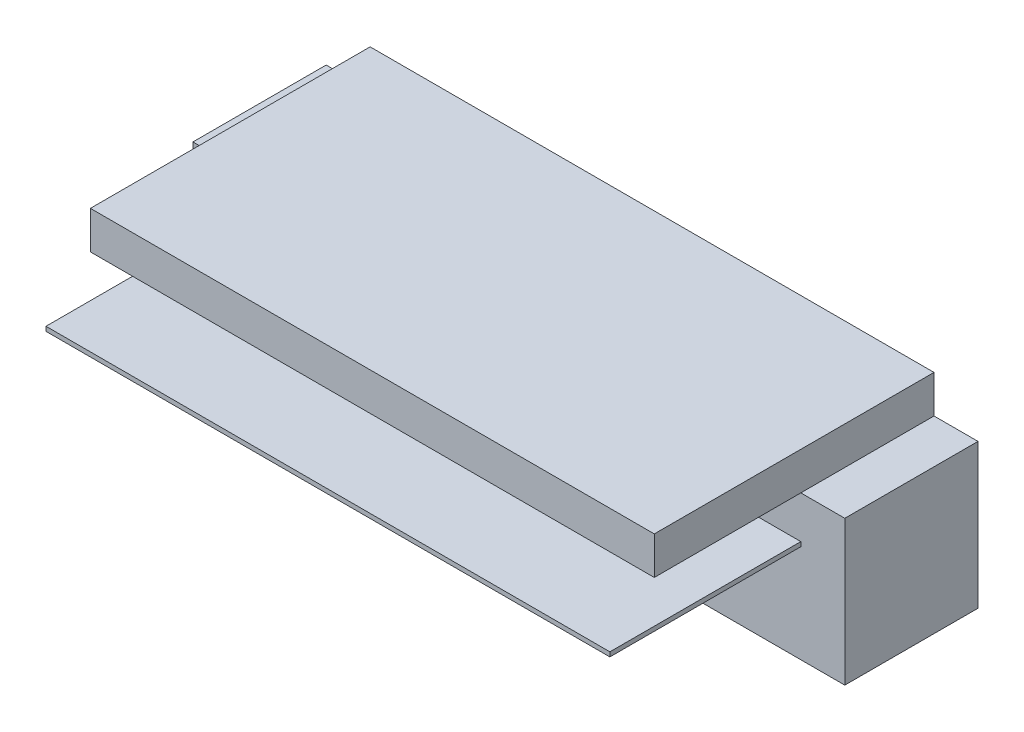
ISO-10303-21;
HEADER;
FILE_DESCRIPTION(('STEP AP214'),'2;1');
FILE_NAME('part.step','',(''),(''),'','','');
FILE_SCHEMA(('AUTOMOTIVE_DESIGN { 1 0 10303 214 1 1 1 1 }'));
ENDSEC;
DATA;
#1=APPLICATION_CONTEXT('core data for automotive mechanical design processes');
#2=APPLICATION_PROTOCOL_DEFINITION('international standard','automotive_design',2000,#1);
#3=PRODUCT_CONTEXT('',#1,'mechanical');
#4=PRODUCT('Part','Part','',(#3));
#5=PRODUCT_RELATED_PRODUCT_CATEGORY('part','',(#4));
#6=PRODUCT_DEFINITION_FORMATION('','',#4);
#7=PRODUCT_DEFINITION_CONTEXT('part definition',#1,'design');
#8=PRODUCT_DEFINITION('design','',#6,#7);
#9=PRODUCT_DEFINITION_SHAPE('','',#8);
#10=(LENGTH_UNIT() NAMED_UNIT(*) SI_UNIT(.MILLI.,.METRE.));
#11=(NAMED_UNIT(*) PLANE_ANGLE_UNIT() SI_UNIT($,.RADIAN.));
#12=(NAMED_UNIT(*) SI_UNIT($,.STERADIAN.) SOLID_ANGLE_UNIT());
#13=UNCERTAINTY_MEASURE_WITH_UNIT(LENGTH_MEASURE(1.E-05),#10,'distance_accuracy_value','');
#14=(GEOMETRIC_REPRESENTATION_CONTEXT(3) GLOBAL_UNCERTAINTY_ASSIGNED_CONTEXT((#13)) GLOBAL_UNIT_ASSIGNED_CONTEXT((#10,
#11,#12)) REPRESENTATION_CONTEXT('',''));
#15=CARTESIAN_POINT('',(0.,0.,0.));
#16=DIRECTION('',(0.,0.,1.));
#17=DIRECTION('',(1.,0.,0.));
#18=AXIS2_PLACEMENT_3D('',#15,#16,#17);
#19=CARTESIAN_POINT('',(14.6812,8.21,-0.300000000000005));
#20=DIRECTION('',(0.,0.,1.));
#21=DIRECTION('',(1.,0.,0.));
#22=AXIS2_PLACEMENT_3D('',#19,#20,#21);
#23=PLANE('',#22);
#24=DIRECTION('',(0.,1.,0.));
#25=VECTOR('',#24,1.);
#26=CARTESIAN_POINT('',(-14.6812,0.,-0.300000000000002));
#27=LINE('',#26,#25);
#28=CARTESIAN_POINT('',(-14.6812,0.,-0.300000000000003));
#29=VERTEX_POINT('',#28);
#30=CARTESIAN_POINT('',(-14.6812,6.51,-0.300000000000009));
#31=VERTEX_POINT('',#30);
#32=EDGE_CURVE('E159',#29,#31,#27,.T.);
#33=ORIENTED_EDGE('',*,*,#32,.F.);
#34=DIRECTION('',(-1.,0.,0.));
#35=VECTOR('',#34,1.);
#36=CARTESIAN_POINT('',(-14.6812,0.,-0.300000000000002));
#37=LINE('',#36,#35);
#38=CARTESIAN_POINT('',(14.6812,0.,-0.300000000000002));
#39=VERTEX_POINT('',#38);
#40=EDGE_CURVE('E161',#39,#29,#37,.T.);
#41=ORIENTED_EDGE('',*,*,#40,.F.);
#42=DIRECTION('',(0.,-1.,0.));
#43=VECTOR('',#42,1.);
#44=CARTESIAN_POINT('',(14.6812,0.,-0.300000000000009));
#45=LINE('',#44,#43);
#46=CARTESIAN_POINT('',(14.6812,6.51,-0.300000000000009));
#47=VERTEX_POINT('',#46);
#48=EDGE_CURVE('E148',#47,#39,#45,.T.);
#49=ORIENTED_EDGE('',*,*,#48,.F.);
#50=DIRECTION('',(1.,0.,0.));
#51=VECTOR('',#50,1.);
#52=CARTESIAN_POINT('',(-14.6812,6.51,-0.300000000000002));
#53=LINE('',#52,#51);
#54=CARTESIAN_POINT('',(12.7,6.51,-0.30000000000001));
#55=VERTEX_POINT('',#54);
#56=EDGE_CURVE('E152',#55,#47,#53,.T.);
#57=ORIENTED_EDGE('',*,*,#56,.F.);
#58=CARTESIAN_POINT('',(-12.7,6.51,-0.300000000000002));
#59=VERTEX_POINT('',#58);
#60=EDGE_CURVE('E214',#59,#55,#53,.T.);
#61=ORIENTED_EDGE('',*,*,#60,.F.);
#62=EDGE_CURVE('E213',#31,#59,#53,.T.);
#63=ORIENTED_EDGE('',*,*,#62,.F.);
#64=EDGE_LOOP('',(#33,#41,#49,#57,#61,#63));
#65=FACE_BOUND('',#64,.T.);
#66=DIRECTION('',(1.,0.,0.));
#67=VECTOR('',#66,1.);
#68=CARTESIAN_POINT('',(14.6812,4.61,-0.300000000000005));
#69=LINE('',#68,#67);
#70=CARTESIAN_POINT('',(-12.7,4.61,-0.300000000000002));
#71=VERTEX_POINT('',#70);
#72=CARTESIAN_POINT('',(12.7,4.61,-0.300000000000005));
#73=VERTEX_POINT('',#72);
#74=EDGE_CURVE('E181',#71,#73,#69,.T.);
#75=ORIENTED_EDGE('',*,*,#74,.T.);
#76=DIRECTION('',(0.,-1.,0.));
#77=VECTOR('',#76,1.);
#78=CARTESIAN_POINT('',(12.7,8.21,-0.300000000000005));
#79=LINE('',#78,#77);
#80=CARTESIAN_POINT('',(12.7,4.41,-0.300000000000002));
#81=VERTEX_POINT('',#80);
#82=EDGE_CURVE('E43',#73,#81,#79,.T.);
#83=ORIENTED_EDGE('',*,*,#82,.T.);
#84=DIRECTION('',(-1.,0.,0.));
#85=VECTOR('',#84,1.);
#86=CARTESIAN_POINT('',(14.6812,4.41,-0.300000000000005));
#87=LINE('',#86,#85);
#88=CARTESIAN_POINT('',(-12.7,4.41,-0.300000000000002));
#89=VERTEX_POINT('',#88);
#90=EDGE_CURVE('E187',#81,#89,#87,.T.);
#91=ORIENTED_EDGE('',*,*,#90,.T.);
#92=DIRECTION('',(0.,1.,0.));
#93=VECTOR('',#92,1.);
#94=CARTESIAN_POINT('',(-12.7,8.21,-0.3));
#95=LINE('',#94,#93);
#96=EDGE_CURVE('E184',#89,#71,#95,.T.);
#97=ORIENTED_EDGE('',*,*,#96,.T.);
#98=EDGE_LOOP('',(#75,#83,#91,#97));
#99=FACE_BOUND('',#98,.T.);
#100=ADVANCED_FACE('F35',(#65,#99),#23,.T.);
#101=CARTESIAN_POINT('',(0.,0.,0.));
#102=DIRECTION('',(0.,1.,0.));
#103=DIRECTION('',(0.,0.,1.));
#104=AXIS2_PLACEMENT_3D('',#101,#102,#103);
#105=PLANE('',#104);
#106=ORIENTED_EDGE('',*,*,#40,.T.);
#107=DIRECTION('',(0.,0.,1.));
#108=VECTOR('',#107,1.);
#109=CARTESIAN_POINT('',(-14.6812,0.,6.3));
#110=LINE('',#109,#108);
#111=CARTESIAN_POINT('',(-14.6812,0.,-6.3));
#112=VERTEX_POINT('',#111);
#113=EDGE_CURVE('E164',#112,#29,#110,.T.);
#114=ORIENTED_EDGE('',*,*,#113,.F.);
#115=DIRECTION('',(-1.,0.,0.));
#116=VECTOR('',#115,1.);
#117=CARTESIAN_POINT('',(14.6812,0.,-6.30000000000001));
#118=LINE('',#117,#116);
#119=CARTESIAN_POINT('',(14.6812,0.,-6.30000000000001));
#120=VERTEX_POINT('',#119);
#121=EDGE_CURVE('E167',#120,#112,#118,.T.);
#122=ORIENTED_EDGE('',*,*,#121,.F.);
#123=DIRECTION('',(0.,0.,-1.));
#124=VECTOR('',#123,1.);
#125=CARTESIAN_POINT('',(14.6812,0.,6.3));
#126=LINE('',#125,#124);
#127=EDGE_CURVE('E173',#39,#120,#126,.T.);
#128=ORIENTED_EDGE('',*,*,#127,.F.);
#129=EDGE_LOOP('',(#106,#114,#122,#128));
#130=FACE_BOUND('',#129,.T.);
#131=ADVANCED_FACE('F238',(#130),#105,.F.);
#132=CARTESIAN_POINT('',(-14.6812,8.21,6.3));
#133=DIRECTION('',(1.,0.,0.));
#134=DIRECTION('',(0.,0.,-1.));
#135=AXIS2_PLACEMENT_3D('',#132,#133,#134);
#136=PLANE('',#135);
#137=ORIENTED_EDGE('',*,*,#32,.T.);
#138=DIRECTION('',(0.,0.,1.));
#139=VECTOR('',#138,1.);
#140=CARTESIAN_POINT('',(-14.6812,6.51,6.3));
#141=LINE('',#140,#139);
#142=CARTESIAN_POINT('',(-14.6812,6.51,-6.3));
#143=VERTEX_POINT('',#142);
#144=EDGE_CURVE('E243',#143,#31,#141,.T.);
#145=ORIENTED_EDGE('',*,*,#144,.F.);
#146=DIRECTION('',(0.,-1.,0.));
#147=VECTOR('',#146,1.);
#148=CARTESIAN_POINT('',(-14.6812,8.21,-6.3));
#149=LINE('',#148,#147);
#150=EDGE_CURVE('E170',#143,#112,#149,.T.);
#151=ORIENTED_EDGE('',*,*,#150,.T.);
#152=ORIENTED_EDGE('',*,*,#113,.T.);
#153=EDGE_LOOP('',(#137,#145,#151,#152));
#154=FACE_BOUND('',#153,.T.);
#155=ADVANCED_FACE('F37',(#154),#136,.F.);
#156=CARTESIAN_POINT('',(14.6812,8.21,6.3));
#157=DIRECTION('',(0.,0.,-1.));
#158=DIRECTION('',(-1.,0.,0.));
#159=AXIS2_PLACEMENT_3D('',#156,#157,#158);
#160=PLANE('',#159);
#161=DIRECTION('',(1.,0.,0.));
#162=VECTOR('',#161,1.);
#163=CARTESIAN_POINT('',(14.6812,8.21,6.3));
#164=LINE('',#163,#162);
#165=CARTESIAN_POINT('',(-12.7,8.21,6.3));
#166=VERTEX_POINT('',#165);
#167=CARTESIAN_POINT('',(12.7,8.21,6.3));
#168=VERTEX_POINT('',#167);
#169=EDGE_CURVE('E144',#166,#168,#164,.T.);
#170=ORIENTED_EDGE('',*,*,#169,.F.);
#171=DIRECTION('',(0.,1.,0.));
#172=VECTOR('',#171,1.);
#173=CARTESIAN_POINT('',(-12.7,6.51,6.3));
#174=LINE('',#173,#172);
#175=CARTESIAN_POINT('',(-12.7,6.51,6.3));
#176=VERTEX_POINT('',#175);
#177=EDGE_CURVE('E130',#176,#166,#174,.T.);
#178=ORIENTED_EDGE('',*,*,#177,.F.);
#179=DIRECTION('',(-1.,0.,0.));
#180=VECTOR('',#179,1.);
#181=CARTESIAN_POINT('',(-14.6812,6.51,6.3));
#182=LINE('',#181,#180);
#183=CARTESIAN_POINT('',(12.7,6.51,6.3));
#184=VERTEX_POINT('',#183);
#185=EDGE_CURVE('E142',#184,#176,#182,.T.);
#186=ORIENTED_EDGE('',*,*,#185,.F.);
#187=DIRECTION('',(0.,1.,0.));
#188=VECTOR('',#187,1.);
#189=CARTESIAN_POINT('',(12.7,6.51,6.3));
#190=LINE('',#189,#188);
#191=EDGE_CURVE('E50',#184,#168,#190,.T.);
#192=ORIENTED_EDGE('',*,*,#191,.T.);
#193=EDGE_LOOP('',(#170,#178,#186,#192));
#194=FACE_BOUND('',#193,.T.);
#195=ADVANCED_FACE('F141',(#194),#160,.F.);
#196=CARTESIAN_POINT('',(14.6812,8.21,6.3));
#197=DIRECTION('',(-1.,0.,0.));
#198=DIRECTION('',(0.,0.,1.));
#199=AXIS2_PLACEMENT_3D('',#196,#197,#198);
#200=PLANE('',#199);
#201=DIRECTION('',(0.,-1.,0.));
#202=VECTOR('',#201,1.);
#203=CARTESIAN_POINT('',(14.6812,8.21,-6.30000000000001));
#204=LINE('',#203,#202);
#205=CARTESIAN_POINT('',(14.6812,6.51,-6.30000000000001));
#206=VERTEX_POINT('',#205);
#207=EDGE_CURVE('E179',#206,#120,#204,.T.);
#208=ORIENTED_EDGE('',*,*,#207,.F.);
#209=DIRECTION('',(0.,0.,-1.));
#210=VECTOR('',#209,1.);
#211=CARTESIAN_POINT('',(14.6812,6.51,-6.30000000000001));
#212=LINE('',#211,#210);
#213=EDGE_CURVE('E224',#47,#206,#212,.T.);
#214=ORIENTED_EDGE('',*,*,#213,.F.);
#215=ORIENTED_EDGE('',*,*,#48,.T.);
#216=ORIENTED_EDGE('',*,*,#127,.T.);
#217=EDGE_LOOP('',(#208,#214,#215,#216));
#218=FACE_BOUND('',#217,.T.);
#219=ADVANCED_FACE('F231',(#218),#200,.F.);
#220=CARTESIAN_POINT('',(14.6812,8.21,-6.30000000000001));
#221=DIRECTION('',(0.,0.,1.));
#222=DIRECTION('',(1.,0.,0.));
#223=AXIS2_PLACEMENT_3D('',#220,#221,#222);
#224=PLANE('',#223);
#225=DIRECTION('',(-1.,0.,0.));
#226=VECTOR('',#225,1.);
#227=CARTESIAN_POINT('',(-14.6812,6.51,-6.3));
#228=LINE('',#227,#226);
#229=CARTESIAN_POINT('',(-12.7,6.51,-6.30000000000001));
#230=VERTEX_POINT('',#229);
#231=EDGE_CURVE('E136',#230,#143,#228,.T.);
#232=ORIENTED_EDGE('',*,*,#231,.F.);
#233=DIRECTION('',(0.,1.,0.));
#234=VECTOR('',#233,1.);
#235=CARTESIAN_POINT('',(-12.7,6.51,-6.30000000000001));
#236=LINE('',#235,#234);
#237=CARTESIAN_POINT('',(-12.7,8.21,-6.30000000000001));
#238=VERTEX_POINT('',#237);
#239=EDGE_CURVE('E145',#230,#238,#236,.T.);
#240=ORIENTED_EDGE('',*,*,#239,.T.);
#241=DIRECTION('',(-1.,0.,0.));
#242=VECTOR('',#241,1.);
#243=CARTESIAN_POINT('',(14.6812,8.21,-6.30000000000001));
#244=LINE('',#243,#242);
#245=CARTESIAN_POINT('',(12.7,8.21,-6.30000000000001));
#246=VERTEX_POINT('',#245);
#247=EDGE_CURVE('E166',#246,#238,#244,.T.);
#248=ORIENTED_EDGE('',*,*,#247,.F.);
#249=DIRECTION('',(0.,1.,0.));
#250=VECTOR('',#249,1.);
#251=CARTESIAN_POINT('',(12.7,6.51,-6.30000000000001));
#252=LINE('',#251,#250);
#253=CARTESIAN_POINT('',(12.7,6.51,-6.30000000000001));
#254=VERTEX_POINT('',#253);
#255=EDGE_CURVE('E249',#254,#246,#252,.T.);
#256=ORIENTED_EDGE('',*,*,#255,.F.);
#257=DIRECTION('',(-1.,0.,0.));
#258=VECTOR('',#257,1.);
#259=CARTESIAN_POINT('',(14.6812,6.51,-6.30000000000001));
#260=LINE('',#259,#258);
#261=EDGE_CURVE('E233',#206,#254,#260,.T.);
#262=ORIENTED_EDGE('',*,*,#261,.F.);
#263=ORIENTED_EDGE('',*,*,#207,.T.);
#264=ORIENTED_EDGE('',*,*,#121,.T.);
#265=ORIENTED_EDGE('',*,*,#150,.F.);
#266=EDGE_LOOP('',(#232,#240,#248,#256,#262,#263,#264,#265));
#267=FACE_BOUND('',#266,.T.);
#268=ADVANCED_FACE('F246',(#267),#224,.F.);
#269=CARTESIAN_POINT('',(0.,8.21,0.));
#270=DIRECTION('',(0.,1.,0.));
#271=DIRECTION('',(0.,0.,1.));
#272=AXIS2_PLACEMENT_3D('',#269,#270,#271);
#273=PLANE('',#272);
#274=DIRECTION('',(0.,0.,-1.));
#275=VECTOR('',#274,1.);
#276=CARTESIAN_POINT('',(-12.7,8.21,6.3));
#277=LINE('',#276,#275);
#278=EDGE_CURVE('E255',#166,#238,#277,.T.);
#279=ORIENTED_EDGE('',*,*,#278,.F.);
#280=ORIENTED_EDGE('',*,*,#169,.T.);
#281=DIRECTION('',(0.,0.,1.));
#282=VECTOR('',#281,1.);
#283=CARTESIAN_POINT('',(12.7,8.21,-6.30000000000001));
#284=LINE('',#283,#282);
#285=EDGE_CURVE('E234',#246,#168,#284,.T.);
#286=ORIENTED_EDGE('',*,*,#285,.F.);
#287=ORIENTED_EDGE('',*,*,#247,.T.);
#288=EDGE_LOOP('',(#279,#280,#286,#287));
#289=FACE_BOUND('',#288,.T.);
#290=ADVANCED_FACE('F286',(#289),#273,.T.);
#291=CARTESIAN_POINT('',(-14.6812,6.51,-36.3754157703597));
#292=DIRECTION('',(0.,1.,0.));
#293=DIRECTION('',(0.,0.,1.));
#294=AXIS2_PLACEMENT_3D('',#291,#292,#293);
#295=PLANE('',#294);
#296=ORIENTED_EDGE('',*,*,#185,.T.);
#297=DIRECTION('',(0.,0.,-1.));
#298=VECTOR('',#297,1.);
#299=CARTESIAN_POINT('',(-12.7,6.51,6.3));
#300=LINE('',#299,#298);
#301=EDGE_CURVE('E127',#176,#59,#300,.T.);
#302=ORIENTED_EDGE('',*,*,#301,.T.);
#303=ORIENTED_EDGE('',*,*,#60,.T.);
#304=DIRECTION('',(0.,0.,1.));
#305=VECTOR('',#304,1.);
#306=CARTESIAN_POINT('',(12.7,6.51,-36.3754157703597));
#307=LINE('',#306,#305);
#308=EDGE_CURVE('E12',#55,#184,#307,.T.);
#309=ORIENTED_EDGE('',*,*,#308,.T.);
#310=EDGE_LOOP('',(#296,#302,#303,#309));
#311=FACE_BOUND('',#310,.T.);
#312=ADVANCED_FACE('F147',(#311),#295,.F.);
#313=CARTESIAN_POINT('',(12.7,8.21,35.7007873893704));
#314=DIRECTION('',(-1.,0.,0.));
#315=DIRECTION('',(0.,0.,1.));
#316=AXIS2_PLACEMENT_3D('',#313,#314,#315);
#317=PLANE('',#316);
#318=ORIENTED_EDGE('',*,*,#82,.F.);
#319=DIRECTION('',(0.,0.,-1.));
#320=VECTOR('',#319,1.);
#321=CARTESIAN_POINT('',(12.7,4.61,35.7007873893704));
#322=LINE('',#321,#320);
#323=CARTESIAN_POINT('',(12.7,4.61,8.3));
#324=VERTEX_POINT('',#323);
#325=EDGE_CURVE('E197',#324,#73,#322,.T.);
#326=ORIENTED_EDGE('',*,*,#325,.F.);
#327=DIRECTION('',(0.,-1.,0.));
#328=VECTOR('',#327,1.);
#329=CARTESIAN_POINT('',(12.7,8.21,8.3));
#330=LINE('',#329,#328);
#331=CARTESIAN_POINT('',(12.7,4.41,8.3));
#332=VERTEX_POINT('',#331);
#333=EDGE_CURVE('E200',#324,#332,#330,.T.);
#334=ORIENTED_EDGE('',*,*,#333,.T.);
#335=DIRECTION('',(0.,0.,-1.));
#336=VECTOR('',#335,1.);
#337=CARTESIAN_POINT('',(12.7,4.41,35.7007873893704));
#338=LINE('',#337,#336);
#339=EDGE_CURVE('E199',#332,#81,#338,.T.);
#340=ORIENTED_EDGE('',*,*,#339,.T.);
#341=EDGE_LOOP('',(#318,#326,#334,#340));
#342=FACE_BOUND('',#341,.T.);
#343=ADVANCED_FACE('F195',(#342),#317,.F.);
#344=CARTESIAN_POINT('',(14.6812,4.41,35.7007873893704));
#345=DIRECTION('',(0.,1.,0.));
#346=DIRECTION('',(-1.,0.,0.));
#347=AXIS2_PLACEMENT_3D('',#344,#345,#346);
#348=PLANE('',#347);
#349=ORIENTED_EDGE('',*,*,#90,.F.);
#350=ORIENTED_EDGE('',*,*,#339,.F.);
#351=DIRECTION('',(-1.,0.,0.));
#352=VECTOR('',#351,1.);
#353=CARTESIAN_POINT('',(14.6812,4.41,8.3));
#354=LINE('',#353,#352);
#355=CARTESIAN_POINT('',(-12.7,4.41,8.3));
#356=VERTEX_POINT('',#355);
#357=EDGE_CURVE('E212',#332,#356,#354,.T.);
#358=ORIENTED_EDGE('',*,*,#357,.T.);
#359=DIRECTION('',(0.,0.,-1.));
#360=VECTOR('',#359,1.);
#361=CARTESIAN_POINT('',(-12.7,4.41,35.7007873893704));
#362=LINE('',#361,#360);
#363=EDGE_CURVE('E203',#356,#89,#362,.T.);
#364=ORIENTED_EDGE('',*,*,#363,.T.);
#365=EDGE_LOOP('',(#349,#350,#358,#364));
#366=FACE_BOUND('',#365,.T.);
#367=ADVANCED_FACE('F275',(#366),#348,.F.);
#368=CARTESIAN_POINT('',(-12.7,8.21,35.7007873893704));
#369=DIRECTION('',(1.,0.,0.));
#370=DIRECTION('',(0.,0.,-1.));
#371=AXIS2_PLACEMENT_3D('',#368,#369,#370);
#372=PLANE('',#371);
#373=ORIENTED_EDGE('',*,*,#96,.F.);
#374=ORIENTED_EDGE('',*,*,#363,.F.);
#375=DIRECTION('',(0.,1.,0.));
#376=VECTOR('',#375,1.);
#377=CARTESIAN_POINT('',(-12.7,8.21,8.3));
#378=LINE('',#377,#376);
#379=CARTESIAN_POINT('',(-12.7,4.61,8.3));
#380=VERTEX_POINT('',#379);
#381=EDGE_CURVE('E155',#356,#380,#378,.T.);
#382=ORIENTED_EDGE('',*,*,#381,.T.);
#383=DIRECTION('',(0.,0.,-1.));
#384=VECTOR('',#383,1.);
#385=CARTESIAN_POINT('',(-12.7,4.61,35.7007873893704));
#386=LINE('',#385,#384);
#387=EDGE_CURVE('E206',#380,#71,#386,.T.);
#388=ORIENTED_EDGE('',*,*,#387,.T.);
#389=EDGE_LOOP('',(#373,#374,#382,#388));
#390=FACE_BOUND('',#389,.T.);
#391=ADVANCED_FACE('F261',(#390),#372,.F.);
#392=CARTESIAN_POINT('',(14.6812,4.61,35.7007873893704));
#393=DIRECTION('',(0.,-1.,0.));
#394=DIRECTION('',(0.,0.,-1.));
#395=AXIS2_PLACEMENT_3D('',#392,#393,#394);
#396=PLANE('',#395);
#397=ORIENTED_EDGE('',*,*,#74,.F.);
#398=ORIENTED_EDGE('',*,*,#387,.F.);
#399=DIRECTION('',(1.,0.,0.));
#400=VECTOR('',#399,1.);
#401=CARTESIAN_POINT('',(14.6812,4.61,8.3));
#402=LINE('',#401,#400);
#403=EDGE_CURVE('E149',#380,#324,#402,.T.);
#404=ORIENTED_EDGE('',*,*,#403,.T.);
#405=ORIENTED_EDGE('',*,*,#325,.T.);
#406=EDGE_LOOP('',(#397,#398,#404,#405));
#407=FACE_BOUND('',#406,.T.);
#408=ADVANCED_FACE('F266',(#407),#396,.F.);
#409=CARTESIAN_POINT('',(14.6812,8.21,8.3));
#410=DIRECTION('',(0.,0.,-1.));
#411=DIRECTION('',(-1.,0.,0.));
#412=AXIS2_PLACEMENT_3D('',#409,#410,#411);
#413=PLANE('',#412);
#414=ORIENTED_EDGE('',*,*,#381,.F.);
#415=ORIENTED_EDGE('',*,*,#357,.F.);
#416=ORIENTED_EDGE('',*,*,#333,.F.);
#417=ORIENTED_EDGE('',*,*,#403,.F.);
#418=EDGE_LOOP('',(#414,#415,#416,#417));
#419=FACE_BOUND('',#418,.T.);
#420=ADVANCED_FACE('F264',(#419),#413,.F.);
#421=CARTESIAN_POINT('',(12.7,6.51,-6.30000000000001));
#422=DIRECTION('',(-1.,0.,0.));
#423=DIRECTION('',(0.,0.,1.));
#424=AXIS2_PLACEMENT_3D('',#421,#422,#423);
#425=PLANE('',#424);
#426=ORIENTED_EDGE('',*,*,#285,.T.);
#427=ORIENTED_EDGE('',*,*,#191,.F.);
#428=ORIENTED_EDGE('',*,*,#308,.F.);
#429=DIRECTION('',(0.,0.,1.));
#430=VECTOR('',#429,1.);
#431=CARTESIAN_POINT('',(12.7,6.51,-6.30000000000001));
#432=LINE('',#431,#430);
#433=EDGE_CURVE('E226',#254,#55,#432,.T.);
#434=ORIENTED_EDGE('',*,*,#433,.F.);
#435=ORIENTED_EDGE('',*,*,#255,.T.);
#436=EDGE_LOOP('',(#426,#427,#428,#434,#435));
#437=FACE_BOUND('',#436,.T.);
#438=ADVANCED_FACE('F273',(#437),#425,.F.);
#439=CARTESIAN_POINT('',(0.,6.51,0.));
#440=DIRECTION('',(0.,-1.,0.));
#441=DIRECTION('',(0.,0.,-1.));
#442=AXIS2_PLACEMENT_3D('',#439,#440,#441);
#443=PLANE('',#442);
#444=ORIENTED_EDGE('',*,*,#56,.T.);
#445=ORIENTED_EDGE('',*,*,#213,.T.);
#446=ORIENTED_EDGE('',*,*,#261,.T.);
#447=ORIENTED_EDGE('',*,*,#433,.T.);
#448=EDGE_LOOP('',(#444,#445,#446,#447));
#449=FACE_BOUND('',#448,.T.);
#450=ADVANCED_FACE('F222',(#449),#443,.F.);
#451=CARTESIAN_POINT('',(-12.7,6.51,6.3));
#452=DIRECTION('',(1.,0.,0.));
#453=DIRECTION('',(0.,0.,-1.));
#454=AXIS2_PLACEMENT_3D('',#451,#452,#453);
#455=PLANE('',#454);
#456=ORIENTED_EDGE('',*,*,#278,.T.);
#457=ORIENTED_EDGE('',*,*,#239,.F.);
#458=EDGE_CURVE('E57',#59,#230,#300,.T.);
#459=ORIENTED_EDGE('',*,*,#458,.F.);
#460=ORIENTED_EDGE('',*,*,#301,.F.);
#461=ORIENTED_EDGE('',*,*,#177,.T.);
#462=EDGE_LOOP('',(#456,#457,#459,#460,#461));
#463=FACE_BOUND('',#462,.T.);
#464=ADVANCED_FACE('F129',(#463),#455,.F.);
#465=CARTESIAN_POINT('',(0.,6.51,0.));
#466=DIRECTION('',(0.,-1.,0.));
#467=DIRECTION('',(0.,0.,-1.));
#468=AXIS2_PLACEMENT_3D('',#465,#466,#467);
#469=PLANE('',#468);
#470=ORIENTED_EDGE('',*,*,#62,.T.);
#471=ORIENTED_EDGE('',*,*,#458,.T.);
#472=ORIENTED_EDGE('',*,*,#231,.T.);
#473=ORIENTED_EDGE('',*,*,#144,.T.);
#474=EDGE_LOOP('',(#470,#471,#472,#473));
#475=FACE_BOUND('',#474,.T.);
#476=ADVANCED_FACE('F374',(#475),#469,.F.);
#477=CLOSED_SHELL('',(#100,#131,#155,#195,#219,#268,#290,#312,#343,#367,#391,#408,#420,#438,
#450,#464,#476));
#478=MANIFOLD_SOLID_BREP('B2',#477);
#479=ADVANCED_BREP_SHAPE_REPRESENTATION('',(#18,#478),#14);
#480=SHAPE_DEFINITION_REPRESENTATION(#9,#479);
ENDSEC;
END-ISO-10303-21;
